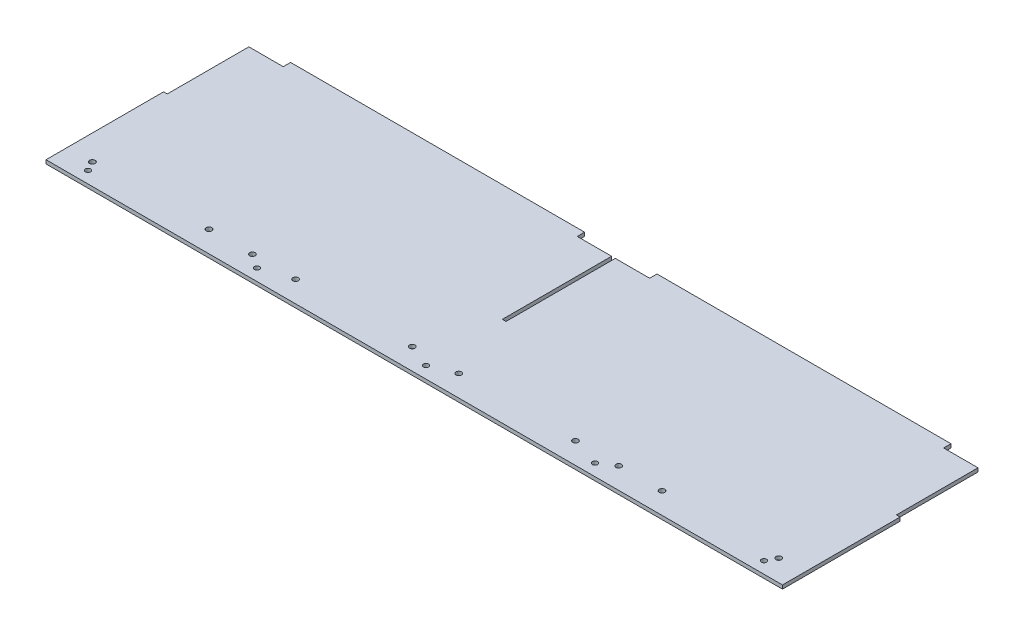
ISO-10303-21;
HEADER;
FILE_DESCRIPTION(('STEP AP214'),'2;1');
FILE_NAME('part.step','',(''),(''),'','','');
FILE_SCHEMA(('AUTOMOTIVE_DESIGN { 1 0 10303 214 1 1 1 1 }'));
ENDSEC;
DATA;
#1=APPLICATION_CONTEXT('core data for automotive mechanical design processes');
#2=APPLICATION_PROTOCOL_DEFINITION('international standard','automotive_design',2000,#1);
#3=PRODUCT_CONTEXT('',#1,'mechanical');
#4=PRODUCT('Part','Part','',(#3));
#5=PRODUCT_RELATED_PRODUCT_CATEGORY('part','',(#4));
#6=PRODUCT_DEFINITION_FORMATION('','',#4);
#7=PRODUCT_DEFINITION_CONTEXT('part definition',#1,'design');
#8=PRODUCT_DEFINITION('design','',#6,#7);
#9=PRODUCT_DEFINITION_SHAPE('','',#8);
#10=(LENGTH_UNIT() NAMED_UNIT(*) SI_UNIT(.MILLI.,.METRE.));
#11=(NAMED_UNIT(*) PLANE_ANGLE_UNIT() SI_UNIT($,.RADIAN.));
#12=(NAMED_UNIT(*) SI_UNIT($,.STERADIAN.) SOLID_ANGLE_UNIT());
#13=UNCERTAINTY_MEASURE_WITH_UNIT(LENGTH_MEASURE(1.E-05),#10,'distance_accuracy_value','');
#14=(GEOMETRIC_REPRESENTATION_CONTEXT(3) GLOBAL_UNCERTAINTY_ASSIGNED_CONTEXT((#13)) GLOBAL_UNIT_ASSIGNED_CONTEXT((#10,
#11,#12)) REPRESENTATION_CONTEXT('',''));
#15=CARTESIAN_POINT('',(0.,0.,0.));
#16=DIRECTION('',(0.,0.,1.));
#17=DIRECTION('',(1.,0.,0.));
#18=AXIS2_PLACEMENT_3D('',#15,#16,#17);
#19=CARTESIAN_POINT('',(0.,3.175,0.));
#20=DIRECTION('',(0.,-1.,0.));
#21=DIRECTION('',(0.,0.,-1.));
#22=AXIS2_PLACEMENT_3D('',#19,#20,#21);
#23=PLANE('',#22);
#24=CARTESIAN_POINT('',(21.6825334955514,3.175,-18.3973199489995));
#25=DIRECTION('',(0.,1.,0.));
#26=DIRECTION('',(0.,0.,1.));
#27=AXIS2_PLACEMENT_3D('',#24,#25,#26);
#28=CIRCLE('',#27,2.39999999999999);
#29=CARTESIAN_POINT('',(21.6825334955514,3.175,-15.9973199489995));
#30=VERTEX_POINT('',#29);
#31=EDGE_CURVE('E714',#30,#30,#28,.T.);
#32=ORIENTED_EDGE('',*,*,#31,.F.);
#33=EDGE_LOOP('',(#32));
#34=FACE_BOUND('',#33,.T.);
#35=CARTESIAN_POINT('',(122.433944247832,3.175,-18.397319949));
#36=DIRECTION('',(0.,1.,0.));
#37=DIRECTION('',(0.,0.,1.));
#38=AXIS2_PLACEMENT_3D('',#35,#36,#37);
#39=CIRCLE('',#38,2.39999999999999);
#40=CARTESIAN_POINT('',(122.433944247832,3.175,-15.997319949));
#41=VERTEX_POINT('',#40);
#42=EDGE_CURVE('E716',#41,#41,#39,.T.);
#43=ORIENTED_EDGE('',*,*,#42,.F.);
#44=EDGE_LOOP('',(#43));
#45=FACE_BOUND('',#44,.T.);
#46=CARTESIAN_POINT('',(159.858710000075,3.175,-18.3973199490005));
#47=DIRECTION('',(0.,1.,0.));
#48=DIRECTION('',(0.,0.,1.));
#49=AXIS2_PLACEMENT_3D('',#46,#47,#48);
#50=CIRCLE('',#49,2.39999999999999);
#51=CARTESIAN_POINT('',(159.858710000075,3.175,-15.9973199490005));
#52=VERTEX_POINT('',#51);
#53=EDGE_CURVE('E724',#52,#52,#50,.T.);
#54=ORIENTED_EDGE('',*,*,#53,.F.);
#55=EDGE_LOOP('',(#54));
#56=FACE_BOUND('',#55,.T.);
#57=CARTESIAN_POINT('',(197.283475752318,3.175,-18.3973199490008));
#58=DIRECTION('',(0.,1.,0.));
#59=DIRECTION('',(0.,0.,1.));
#60=AXIS2_PLACEMENT_3D('',#57,#58,#59);
#61=CIRCLE('',#60,2.39999999999999);
#62=CARTESIAN_POINT('',(197.283475752318,3.175,-15.9973199490008));
#63=VERTEX_POINT('',#62);
#64=EDGE_CURVE('E730',#63,#63,#61,.T.);
#65=ORIENTED_EDGE('',*,*,#64,.F.);
#66=EDGE_LOOP('',(#65));
#67=FACE_BOUND('',#66,.T.);
#68=CARTESIAN_POINT('',(298.034886504599,3.175,-18.3973199490015));
#69=DIRECTION('',(0.,1.,0.));
#70=DIRECTION('',(0.,0.,1.));
#71=AXIS2_PLACEMENT_3D('',#68,#69,#70);
#72=CIRCLE('',#71,2.40000000000001);
#73=CARTESIAN_POINT('',(298.034886504599,3.175,-15.9973199490014));
#74=VERTEX_POINT('',#73);
#75=EDGE_CURVE('E736',#74,#74,#72,.T.);
#76=ORIENTED_EDGE('',*,*,#75,.F.);
#77=EDGE_LOOP('',(#76));
#78=FACE_BOUND('',#77,.T.);
#79=CARTESIAN_POINT('',(338.224953495399,3.175,-18.3973199490015));
#80=DIRECTION('',(0.,1.,0.));
#81=DIRECTION('',(0.,0.,1.));
#82=AXIS2_PLACEMENT_3D('',#79,#80,#81);
#83=CIRCLE('',#82,2.40000000000001);
#84=CARTESIAN_POINT('',(338.224953495399,3.175,-15.9973199490014));
#85=VERTEX_POINT('',#84);
#86=EDGE_CURVE('E742',#85,#85,#83,.T.);
#87=ORIENTED_EDGE('',*,*,#86,.F.);
#88=EDGE_LOOP('',(#87));
#89=FACE_BOUND('',#88,.T.);
#90=CARTESIAN_POINT('',(438.97636424768,3.175,-18.3973199490008));
#91=DIRECTION('',(0.,1.,0.));
#92=DIRECTION('',(0.,0.,1.));
#93=AXIS2_PLACEMENT_3D('',#90,#91,#92);
#94=CIRCLE('',#93,2.40000000000001);
#95=CARTESIAN_POINT('',(438.97636424768,3.175,-15.9973199490008));
#96=VERTEX_POINT('',#95);
#97=EDGE_CURVE('E748',#96,#96,#94,.T.);
#98=ORIENTED_EDGE('',*,*,#97,.F.);
#99=EDGE_LOOP('',(#98));
#100=FACE_BOUND('',#99,.T.);
#101=CARTESIAN_POINT('',(513.825895752166,3.175,-18.397319949));
#102=DIRECTION('',(0.,1.,0.));
#103=DIRECTION('',(0.,0.,1.));
#104=AXIS2_PLACEMENT_3D('',#101,#102,#103);
#105=CIRCLE('',#104,2.39999999999996);
#106=CARTESIAN_POINT('',(513.825895752166,3.175,-15.9973199490001));
#107=VERTEX_POINT('',#106);
#108=EDGE_CURVE('E760',#107,#107,#105,.T.);
#109=ORIENTED_EDGE('',*,*,#108,.F.);
#110=EDGE_LOOP('',(#109));
#111=FACE_BOUND('',#110,.T.);
#112=CARTESIAN_POINT('',(614.577306504446,3.175,-18.3973199489995));
#113=DIRECTION('',(0.,1.,0.));
#114=DIRECTION('',(0.,0.,1.));
#115=AXIS2_PLACEMENT_3D('',#112,#113,#114);
#116=CIRCLE('',#115,2.39999999999996);
#117=CARTESIAN_POINT('',(614.577306504446,3.175,-15.9973199489996));
#118=VERTEX_POINT('',#117);
#119=EDGE_CURVE('E766',#118,#118,#116,.T.);
#120=ORIENTED_EDGE('',*,*,#119,.F.);
#121=EDGE_LOOP('',(#120));
#122=FACE_BOUND('',#121,.T.);
#123=CARTESIAN_POINT('',(26.1071067810834,3.175,-10.1600000000008));
#124=DIRECTION('',(0.,1.,0.));
#125=DIRECTION('',(0.,0.,1.));
#126=AXIS2_PLACEMENT_3D('',#123,#124,#125);
#127=CIRCLE('',#126,2.25);
#128=CARTESIAN_POINT('',(26.1071067810834,3.175,-7.91000000000078));
#129=VERTEX_POINT('',#128);
#130=EDGE_CURVE('E776',#129,#129,#127,.T.);
#131=ORIENTED_EDGE('',*,*,#130,.F.);
#132=EDGE_LOOP('',(#131));
#133=FACE_BOUND('',#132,.T.);
#134=CARTESIAN_POINT('',(172.118513390515,3.175,-10.1600000000008));
#135=DIRECTION('',(0.,1.,0.));
#136=DIRECTION('',(0.,0.,1.));
#137=AXIS2_PLACEMENT_3D('',#134,#135,#136);
#138=CIRCLE('',#137,2.25000000000001);
#139=CARTESIAN_POINT('',(172.118513390515,3.175,-7.91000000000077));
#140=VERTEX_POINT('',#139);
#141=EDGE_CURVE('E782',#140,#140,#138,.T.);
#142=ORIENTED_EDGE('',*,*,#141,.F.);
#143=EDGE_LOOP('',(#142));
#144=FACE_BOUND('',#143,.T.);
#145=CARTESIAN_POINT('',(318.129919999947,3.175,-10.1600000000008));
#146=DIRECTION('',(0.,1.,0.));
#147=DIRECTION('',(0.,0.,1.));
#148=AXIS2_PLACEMENT_3D('',#145,#146,#147);
#149=CIRCLE('',#148,2.24999999999995);
#150=CARTESIAN_POINT('',(318.129919999947,3.175,-7.91000000000083));
#151=VERTEX_POINT('',#150);
#152=EDGE_CURVE('E788',#151,#151,#149,.T.);
#153=ORIENTED_EDGE('',*,*,#152,.F.);
#154=EDGE_LOOP('',(#153));
#155=FACE_BOUND('',#154,.T.);
#156=CARTESIAN_POINT('',(464.141326609379,3.175,-10.1600000000008));
#157=DIRECTION('',(0.,1.,0.));
#158=DIRECTION('',(0.,0.,1.));
#159=AXIS2_PLACEMENT_3D('',#156,#157,#158);
#160=CIRCLE('',#159,2.24999999999995);
#161=CARTESIAN_POINT('',(464.141326609379,3.175,-7.91000000000088));
#162=VERTEX_POINT('',#161);
#163=EDGE_CURVE('E794',#162,#162,#160,.T.);
#164=ORIENTED_EDGE('',*,*,#163,.F.);
#165=EDGE_LOOP('',(#164));
#166=FACE_BOUND('',#165,.T.);
#167=CARTESIAN_POINT('',(610.152733218811,3.175,-10.1600000000008));
#168=DIRECTION('',(0.,1.,0.));
#169=DIRECTION('',(0.,0.,1.));
#170=AXIS2_PLACEMENT_3D('',#167,#168,#169);
#171=CIRCLE('',#170,2.25000000000001);
#172=CARTESIAN_POINT('',(610.152733218811,3.175,-7.91000000000083));
#173=VERTEX_POINT('',#172);
#174=EDGE_CURVE('E772',#173,#173,#171,.T.);
#175=ORIENTED_EDGE('',*,*,#174,.F.);
#176=EDGE_LOOP('',(#175));
#177=FACE_BOUND('',#176,.T.);
#178=DIRECTION('',(0.,0.,-1.));
#179=VECTOR('',#178,1.);
#180=CARTESIAN_POINT('',(0.,3.175,0.));
#181=LINE('',#180,#179);
#182=CARTESIAN_POINT('',(0.,3.175,0.));
#183=VERTEX_POINT('',#182);
#184=CARTESIAN_POINT('',(0.,3.175,-101.6));
#185=VERTEX_POINT('',#184);
#186=EDGE_CURVE('E308',#183,#185,#181,.T.);
#187=ORIENTED_EDGE('',*,*,#186,.F.);
#188=DIRECTION('',(1.,0.,0.));
#189=VECTOR('',#188,1.);
#190=CARTESIAN_POINT('',(0.,3.175,0.));
#191=LINE('',#190,#189);
#192=CARTESIAN_POINT('',(636.25984,3.175,0.));
#193=VERTEX_POINT('',#192);
#194=EDGE_CURVE('E229',#183,#193,#191,.T.);
#195=ORIENTED_EDGE('',*,*,#194,.T.);
#196=DIRECTION('',(0.,0.,-1.));
#197=VECTOR('',#196,1.);
#198=CARTESIAN_POINT('',(636.25984,3.175,0.));
#199=LINE('',#198,#197);
#200=CARTESIAN_POINT('',(636.25984,3.175,-101.6));
#201=VERTEX_POINT('',#200);
#202=EDGE_CURVE('E11',#193,#201,#199,.T.);
#203=ORIENTED_EDGE('',*,*,#202,.T.);
#204=DIRECTION('',(-1.,0.,0.));
#205=VECTOR('',#204,1.);
#206=CARTESIAN_POINT('',(636.25984,3.175,-101.6));
#207=LINE('',#206,#205);
#208=CARTESIAN_POINT('',(633.08484,3.175,-101.6));
#209=VERTEX_POINT('',#208);
#210=EDGE_CURVE('E266',#201,#209,#207,.T.);
#211=ORIENTED_EDGE('',*,*,#210,.T.);
#212=DIRECTION('',(0.,0.,-1.));
#213=VECTOR('',#212,1.);
#214=CARTESIAN_POINT('',(633.08484,3.175,-101.6));
#215=LINE('',#214,#213);
#216=CARTESIAN_POINT('',(633.08484,3.175,-172.09262));
#217=VERTEX_POINT('',#216);
#218=EDGE_CURVE('E257',#209,#217,#215,.T.);
#219=ORIENTED_EDGE('',*,*,#218,.T.);
#220=DIRECTION('',(1.,0.,0.));
#221=VECTOR('',#220,1.);
#222=CARTESIAN_POINT('',(0.,3.175,-172.09262));
#223=LINE('',#222,#221);
#224=CARTESIAN_POINT('',(603.40113,3.17500000000132,-172.09262));
#225=VERTEX_POINT('',#224);
#226=EDGE_CURVE('E310',#225,#217,#223,.T.);
#227=ORIENTED_EDGE('',*,*,#226,.F.);
#228=DIRECTION('',(0.,0.,1.));
#229=VECTOR('',#228,1.);
#230=CARTESIAN_POINT('',(603.40113,3.17500000000132,-178.44262));
#231=LINE('',#230,#229);
#232=CARTESIAN_POINT('',(603.40113,3.17500000000132,-178.44262));
#233=VERTEX_POINT('',#232);
#234=EDGE_CURVE('E218',#233,#225,#231,.T.);
#235=ORIENTED_EDGE('',*,*,#234,.F.);
#236=DIRECTION('',(1.,0.,0.));
#237=VECTOR('',#236,1.);
#238=CARTESIAN_POINT('',(603.40113,3.17500000000132,-178.44262));
#239=LINE('',#238,#237);
#240=CARTESIAN_POINT('',(349.40113,3.17500000000132,-178.44262));
#241=VERTEX_POINT('',#240);
#242=EDGE_CURVE('E217',#241,#233,#239,.T.);
#243=ORIENTED_EDGE('',*,*,#242,.F.);
#244=DIRECTION('',(0.,0.,1.));
#245=VECTOR('',#244,1.);
#246=CARTESIAN_POINT('',(349.40113,3.17500000000132,-178.44262));
#247=LINE('',#246,#245);
#248=CARTESIAN_POINT('',(349.40113,3.17500000000132,-172.09262));
#249=VERTEX_POINT('',#248);
#250=EDGE_CURVE('E222',#241,#249,#247,.T.);
#251=ORIENTED_EDGE('',*,*,#250,.T.);
#252=CARTESIAN_POINT('',(319.717419999999,3.17500000000132,-172.09262));
#253=VERTEX_POINT('',#252);
#254=EDGE_CURVE('E312',#253,#249,#223,.T.);
#255=ORIENTED_EDGE('',*,*,#254,.F.);
#256=DIRECTION('',(0.,0.,-1.));
#257=VECTOR('',#256,1.);
#258=CARTESIAN_POINT('',(319.717419999999,3.17500000000132,-77.72654));
#259=LINE('',#258,#257);
#260=CARTESIAN_POINT('',(319.717419999999,3.17500000000132,-77.72654));
#261=VERTEX_POINT('',#260);
#262=EDGE_CURVE('E297',#261,#253,#259,.T.);
#263=ORIENTED_EDGE('',*,*,#262,.F.);
#264=DIRECTION('',(1.,-3.32192716029536E-13,0.));
#265=VECTOR('',#264,1.);
#266=CARTESIAN_POINT('',(319.717419999999,3.17500000000132,-77.72654));
#267=LINE('',#266,#265);
#268=CARTESIAN_POINT('',(316.542419999999,3.17500000000237,-77.72654));
#269=VERTEX_POINT('',#268);
#270=EDGE_CURVE('E290',#269,#261,#267,.T.);
#271=ORIENTED_EDGE('',*,*,#270,.F.);
#272=DIRECTION('',(0.,0.,-1.));
#273=VECTOR('',#272,1.);
#274=CARTESIAN_POINT('',(316.542419999999,3.17500000000237,-77.72654));
#275=LINE('',#274,#273);
#276=CARTESIAN_POINT('',(316.542419999999,3.17500000000237,-172.09262));
#277=VERTEX_POINT('',#276);
#278=EDGE_CURVE('E300',#269,#277,#275,.T.);
#279=ORIENTED_EDGE('',*,*,#278,.T.);
#280=CARTESIAN_POINT('',(286.858709999998,3.17500000000132,-172.09262));
#281=VERTEX_POINT('',#280);
#282=EDGE_CURVE('E311',#281,#277,#223,.T.);
#283=ORIENTED_EDGE('',*,*,#282,.F.);
#284=DIRECTION('',(0.,0.,1.));
#285=VECTOR('',#284,1.);
#286=CARTESIAN_POINT('',(286.858709999998,3.17500000000132,-178.44262));
#287=LINE('',#286,#285);
#288=CARTESIAN_POINT('',(286.858709999998,3.17500000000132,-178.44262));
#289=VERTEX_POINT('',#288);
#290=EDGE_CURVE('E187',#289,#281,#287,.T.);
#291=ORIENTED_EDGE('',*,*,#290,.F.);
#292=DIRECTION('',(1.,0.,0.));
#293=VECTOR('',#292,1.);
#294=CARTESIAN_POINT('',(32.858709999998,3.17500000000132,-178.44262));
#295=LINE('',#294,#293);
#296=CARTESIAN_POINT('',(32.858709999998,3.17500000000132,-178.44262));
#297=VERTEX_POINT('',#296);
#298=EDGE_CURVE('E179',#297,#289,#295,.T.);
#299=ORIENTED_EDGE('',*,*,#298,.F.);
#300=DIRECTION('',(0.,0.,1.));
#301=VECTOR('',#300,1.);
#302=CARTESIAN_POINT('',(32.858709999998,3.17500000000132,-178.44262));
#303=LINE('',#302,#301);
#304=CARTESIAN_POINT('',(32.858709999998,3.17500000000132,-172.09262));
#305=VERTEX_POINT('',#304);
#306=EDGE_CURVE('E184',#297,#305,#303,.T.);
#307=ORIENTED_EDGE('',*,*,#306,.T.);
#308=CARTESIAN_POINT('',(3.175,3.175,-172.09262));
#309=VERTEX_POINT('',#308);
#310=EDGE_CURVE('E49',#309,#305,#223,.T.);
#311=ORIENTED_EDGE('',*,*,#310,.F.);
#312=DIRECTION('',(0.,0.,-1.));
#313=VECTOR('',#312,1.);
#314=CARTESIAN_POINT('',(3.175,3.175,-101.6));
#315=LINE('',#314,#313);
#316=CARTESIAN_POINT('',(3.175,3.175,-101.6));
#317=VERTEX_POINT('',#316);
#318=EDGE_CURVE('E254',#317,#309,#315,.T.);
#319=ORIENTED_EDGE('',*,*,#318,.F.);
#320=DIRECTION('',(-1.,0.,0.));
#321=VECTOR('',#320,1.);
#322=CARTESIAN_POINT('',(0.,3.175,-101.6));
#323=LINE('',#322,#321);
#324=EDGE_CURVE('E251',#317,#185,#323,.T.);
#325=ORIENTED_EDGE('',*,*,#324,.T.);
#326=EDGE_LOOP('',(#187,#195,#203,#211,#219,#227,#235,#243,#251,#255,#263,#271,#279,#283,#291,
#299,#307,#311,#319,#325));
#327=FACE_BOUND('',#326,.T.);
#328=CARTESIAN_POINT('',(476.401129999923,3.175,-18.3973199490005));
#329=DIRECTION('',(0.,1.,0.));
#330=DIRECTION('',(0.,0.,1.));
#331=AXIS2_PLACEMENT_3D('',#328,#329,#330);
#332=CIRCLE('',#331,2.40000000000001);
#333=CARTESIAN_POINT('',(476.401129999923,3.175,-15.9973199490005));
#334=VERTEX_POINT('',#333);
#335=EDGE_CURVE('E754',#334,#334,#332,.T.);
#336=ORIENTED_EDGE('',*,*,#335,.F.);
#337=EDGE_LOOP('',(#336));
#338=FACE_BOUND('',#337,.T.);
#339=ADVANCED_FACE('F40',(#34,#45,#56,#67,#78,#89,#100,#111,#122,#133,#144,#155,#166,#177,#327,
#338),#23,.F.);
#340=CARTESIAN_POINT('',(0.,3.175,-172.09262));
#341=DIRECTION('',(0.,0.,-1.));
#342=DIRECTION('',(-1.,0.,0.));
#343=AXIS2_PLACEMENT_3D('',#340,#341,#342);
#344=PLANE('',#343);
#345=ORIENTED_EDGE('',*,*,#310,.T.);
#346=DIRECTION('',(0.,1.,0.));
#347=VECTOR('',#346,1.);
#348=CARTESIAN_POINT('',(32.858709999998,3.17500000000132,-172.09262));
#349=LINE('',#348,#347);
#350=CARTESIAN_POINT('',(32.858709999998,9.43689570931383E-13,-172.09262));
#351=VERTEX_POINT('',#350);
#352=EDGE_CURVE('E202',#351,#305,#349,.T.);
#353=ORIENTED_EDGE('',*,*,#352,.F.);
#354=DIRECTION('',(1.,0.,0.));
#355=VECTOR('',#354,1.);
#356=CARTESIAN_POINT('',(0.,0.,-172.09262));
#357=LINE('',#356,#355);
#358=CARTESIAN_POINT('',(3.175,0.,-172.09262));
#359=VERTEX_POINT('',#358);
#360=EDGE_CURVE('E315',#359,#351,#357,.T.);
#361=ORIENTED_EDGE('',*,*,#360,.F.);
#362=DIRECTION('',(0.,1.,0.));
#363=VECTOR('',#362,1.);
#364=CARTESIAN_POINT('',(3.175,3.175,-172.09262));
#365=LINE('',#364,#363);
#366=EDGE_CURVE('E246',#359,#309,#365,.T.);
#367=ORIENTED_EDGE('',*,*,#366,.T.);
#368=EDGE_LOOP('',(#345,#353,#361,#367));
#369=FACE_BOUND('',#368,.T.);
#370=ADVANCED_FACE('F378',(#369),#344,.T.);
#371=CARTESIAN_POINT('',(286.858709999998,0.,-172.09262));
#372=VERTEX_POINT('',#371);
#373=CARTESIAN_POINT('',(316.542419999999,9.43689570931383E-13,-172.09262));
#374=VERTEX_POINT('',#373);
#375=EDGE_CURVE('E317',#372,#374,#357,.T.);
#376=ORIENTED_EDGE('',*,*,#375,.F.);
#377=DIRECTION('',(0.,-1.,0.));
#378=VECTOR('',#377,1.);
#379=CARTESIAN_POINT('',(286.858709999998,3.17500000000132,-172.09262));
#380=LINE('',#379,#378);
#381=EDGE_CURVE('E198',#281,#372,#380,.T.);
#382=ORIENTED_EDGE('',*,*,#381,.F.);
#383=ORIENTED_EDGE('',*,*,#282,.T.);
#384=DIRECTION('',(0.,1.,0.));
#385=VECTOR('',#384,1.);
#386=CARTESIAN_POINT('',(316.542419999999,3.17500000000237,-172.09262));
#387=LINE('',#386,#385);
#388=EDGE_CURVE('E284',#374,#277,#387,.T.);
#389=ORIENTED_EDGE('',*,*,#388,.F.);
#390=EDGE_LOOP('',(#376,#382,#383,#389));
#391=FACE_BOUND('',#390,.T.);
#392=ADVANCED_FACE('F340',(#391),#344,.T.);
#393=CARTESIAN_POINT('',(603.40113,0.,-172.09262));
#394=VERTEX_POINT('',#393);
#395=CARTESIAN_POINT('',(633.08484,0.,-172.09262));
#396=VERTEX_POINT('',#395);
#397=EDGE_CURVE('E314',#394,#396,#357,.T.);
#398=ORIENTED_EDGE('',*,*,#397,.F.);
#399=DIRECTION('',(0.,-1.,0.));
#400=VECTOR('',#399,1.);
#401=CARTESIAN_POINT('',(603.40113,3.17500000000132,-172.09262));
#402=LINE('',#401,#400);
#403=EDGE_CURVE('E65',#225,#394,#402,.T.);
#404=ORIENTED_EDGE('',*,*,#403,.F.);
#405=ORIENTED_EDGE('',*,*,#226,.T.);
#406=DIRECTION('',(0.,-1.,0.));
#407=VECTOR('',#406,1.);
#408=CARTESIAN_POINT('',(633.08484,3.175,-172.09262));
#409=LINE('',#408,#407);
#410=EDGE_CURVE('E239',#217,#396,#409,.T.);
#411=ORIENTED_EDGE('',*,*,#410,.T.);
#412=EDGE_LOOP('',(#398,#404,#405,#411));
#413=FACE_BOUND('',#412,.T.);
#414=ADVANCED_FACE('F332',(#413),#344,.T.);
#415=ORIENTED_EDGE('',*,*,#254,.T.);
#416=DIRECTION('',(0.,1.,0.));
#417=VECTOR('',#416,1.);
#418=CARTESIAN_POINT('',(349.40113,3.17500000000132,-172.09262));
#419=LINE('',#418,#417);
#420=CARTESIAN_POINT('',(349.40113,9.43689570931383E-13,-172.09262));
#421=VERTEX_POINT('',#420);
#422=EDGE_CURVE('E205',#421,#249,#419,.T.);
#423=ORIENTED_EDGE('',*,*,#422,.F.);
#424=CARTESIAN_POINT('',(319.717419999999,9.43689570931383E-13,-172.09262));
#425=VERTEX_POINT('',#424);
#426=EDGE_CURVE('E318',#425,#421,#357,.T.);
#427=ORIENTED_EDGE('',*,*,#426,.F.);
#428=DIRECTION('',(0.,-1.,0.));
#429=VECTOR('',#428,1.);
#430=CARTESIAN_POINT('',(319.717419999999,3.17500000000132,-172.09262));
#431=LINE('',#430,#429);
#432=EDGE_CURVE('E262',#253,#425,#431,.T.);
#433=ORIENTED_EDGE('',*,*,#432,.F.);
#434=EDGE_LOOP('',(#415,#423,#427,#433));
#435=FACE_BOUND('',#434,.T.);
#436=ADVANCED_FACE('F355',(#435),#344,.T.);
#437=CARTESIAN_POINT('',(636.25984,3.175,0.));
#438=DIRECTION('',(-1.,0.,0.));
#439=DIRECTION('',(0.,0.,1.));
#440=AXIS2_PLACEMENT_3D('',#437,#438,#439);
#441=PLANE('',#440);
#442=ORIENTED_EDGE('',*,*,#202,.F.);
#443=DIRECTION('',(0.,1.,0.));
#444=VECTOR('',#443,1.);
#445=CARTESIAN_POINT('',(636.25984,0.,0.));
#446=LINE('',#445,#444);
#447=CARTESIAN_POINT('',(636.25984,0.,0.));
#448=VERTEX_POINT('',#447);
#449=EDGE_CURVE('E236',#448,#193,#446,.T.);
#450=ORIENTED_EDGE('',*,*,#449,.F.);
#451=DIRECTION('',(0.,0.,-1.));
#452=VECTOR('',#451,1.);
#453=CARTESIAN_POINT('',(636.25984,0.,0.));
#454=LINE('',#453,#452);
#455=CARTESIAN_POINT('',(636.25984,0.,-101.6));
#456=VERTEX_POINT('',#455);
#457=EDGE_CURVE('E44',#448,#456,#454,.T.);
#458=ORIENTED_EDGE('',*,*,#457,.T.);
#459=DIRECTION('',(0.,1.,0.));
#460=VECTOR('',#459,1.);
#461=CARTESIAN_POINT('',(636.25984,3.175,-101.6));
#462=LINE('',#461,#460);
#463=EDGE_CURVE('E263',#456,#201,#462,.T.);
#464=ORIENTED_EDGE('',*,*,#463,.T.);
#465=EDGE_LOOP('',(#442,#450,#458,#464));
#466=FACE_BOUND('',#465,.T.);
#467=ADVANCED_FACE('F394',(#466),#441,.F.);
#468=CARTESIAN_POINT('',(0.,0.,0.));
#469=DIRECTION('',(0.,-1.,0.));
#470=DIRECTION('',(0.,0.,-1.));
#471=AXIS2_PLACEMENT_3D('',#468,#469,#470);
#472=PLANE('',#471);
#473=CARTESIAN_POINT('',(21.6825334955514,0.,-18.3973199489995));
#474=DIRECTION('',(0.,1.,0.));
#475=DIRECTION('',(0.,0.,1.));
#476=AXIS2_PLACEMENT_3D('',#473,#474,#475);
#477=CIRCLE('',#476,2.4);
#478=CARTESIAN_POINT('',(21.6825334955514,0.,-15.9973199489995));
#479=VERTEX_POINT('',#478);
#480=EDGE_CURVE('E712',#479,#479,#477,.T.);
#481=ORIENTED_EDGE('',*,*,#480,.T.);
#482=EDGE_LOOP('',(#481));
#483=FACE_BOUND('',#482,.T.);
#484=CARTESIAN_POINT('',(122.433944247832,0.,-18.397319949));
#485=DIRECTION('',(0.,1.,0.));
#486=DIRECTION('',(0.,0.,1.));
#487=AXIS2_PLACEMENT_3D('',#484,#485,#486);
#488=CIRCLE('',#487,2.4);
#489=CARTESIAN_POINT('',(122.433944247832,0.,-15.997319949));
#490=VERTEX_POINT('',#489);
#491=EDGE_CURVE('E721',#490,#490,#488,.T.);
#492=ORIENTED_EDGE('',*,*,#491,.T.);
#493=EDGE_LOOP('',(#492));
#494=FACE_BOUND('',#493,.T.);
#495=CARTESIAN_POINT('',(159.858710000075,0.,-18.3973199490005));
#496=DIRECTION('',(0.,1.,0.));
#497=DIRECTION('',(0.,0.,1.));
#498=AXIS2_PLACEMENT_3D('',#495,#496,#497);
#499=CIRCLE('',#498,2.39999999999999);
#500=CARTESIAN_POINT('',(159.858710000075,0.,-15.9973199490005));
#501=VERTEX_POINT('',#500);
#502=EDGE_CURVE('E727',#501,#501,#499,.T.);
#503=ORIENTED_EDGE('',*,*,#502,.T.);
#504=EDGE_LOOP('',(#503));
#505=FACE_BOUND('',#504,.T.);
#506=CARTESIAN_POINT('',(197.283475752318,0.,-18.3973199490008));
#507=DIRECTION('',(0.,1.,0.));
#508=DIRECTION('',(0.,0.,1.));
#509=AXIS2_PLACEMENT_3D('',#506,#507,#508);
#510=CIRCLE('',#509,2.39999999999999);
#511=CARTESIAN_POINT('',(197.283475752318,0.,-15.9973199490008));
#512=VERTEX_POINT('',#511);
#513=EDGE_CURVE('E733',#512,#512,#510,.T.);
#514=ORIENTED_EDGE('',*,*,#513,.T.);
#515=EDGE_LOOP('',(#514));
#516=FACE_BOUND('',#515,.T.);
#517=CARTESIAN_POINT('',(298.034886504599,0.,-18.3973199490015));
#518=DIRECTION('',(0.,1.,0.));
#519=DIRECTION('',(0.,0.,1.));
#520=AXIS2_PLACEMENT_3D('',#517,#518,#519);
#521=CIRCLE('',#520,2.40000000000001);
#522=CARTESIAN_POINT('',(298.034886504599,0.,-15.9973199490014));
#523=VERTEX_POINT('',#522);
#524=EDGE_CURVE('E739',#523,#523,#521,.T.);
#525=ORIENTED_EDGE('',*,*,#524,.T.);
#526=EDGE_LOOP('',(#525));
#527=FACE_BOUND('',#526,.T.);
#528=CARTESIAN_POINT('',(338.224953495399,0.,-18.3973199490015));
#529=DIRECTION('',(0.,1.,0.));
#530=DIRECTION('',(0.,0.,1.));
#531=AXIS2_PLACEMENT_3D('',#528,#529,#530);
#532=CIRCLE('',#531,2.40000000000001);
#533=CARTESIAN_POINT('',(338.224953495399,0.,-15.9973199490014));
#534=VERTEX_POINT('',#533);
#535=EDGE_CURVE('E745',#534,#534,#532,.T.);
#536=ORIENTED_EDGE('',*,*,#535,.T.);
#537=EDGE_LOOP('',(#536));
#538=FACE_BOUND('',#537,.T.);
#539=CARTESIAN_POINT('',(438.97636424768,0.,-18.3973199490008));
#540=DIRECTION('',(0.,1.,0.));
#541=DIRECTION('',(0.,0.,1.));
#542=AXIS2_PLACEMENT_3D('',#539,#540,#541);
#543=CIRCLE('',#542,2.40000000000001);
#544=CARTESIAN_POINT('',(438.97636424768,0.,-15.9973199490008));
#545=VERTEX_POINT('',#544);
#546=EDGE_CURVE('E751',#545,#545,#543,.T.);
#547=ORIENTED_EDGE('',*,*,#546,.T.);
#548=EDGE_LOOP('',(#547));
#549=FACE_BOUND('',#548,.T.);
#550=CARTESIAN_POINT('',(476.401129999923,0.,-18.3973199490005));
#551=DIRECTION('',(0.,1.,0.));
#552=DIRECTION('',(0.,0.,1.));
#553=AXIS2_PLACEMENT_3D('',#550,#551,#552);
#554=CIRCLE('',#553,2.40000000000001);
#555=CARTESIAN_POINT('',(476.401129999923,0.,-15.9973199490005));
#556=VERTEX_POINT('',#555);
#557=EDGE_CURVE('E757',#556,#556,#554,.T.);
#558=ORIENTED_EDGE('',*,*,#557,.T.);
#559=EDGE_LOOP('',(#558));
#560=FACE_BOUND('',#559,.T.);
#561=CARTESIAN_POINT('',(513.825895752166,0.,-18.397319949));
#562=DIRECTION('',(0.,1.,0.));
#563=DIRECTION('',(0.,0.,1.));
#564=AXIS2_PLACEMENT_3D('',#561,#562,#563);
#565=CIRCLE('',#564,2.39999999999996);
#566=CARTESIAN_POINT('',(513.825895752166,0.,-15.9973199490001));
#567=VERTEX_POINT('',#566);
#568=EDGE_CURVE('E763',#567,#567,#565,.T.);
#569=ORIENTED_EDGE('',*,*,#568,.T.);
#570=EDGE_LOOP('',(#569));
#571=FACE_BOUND('',#570,.T.);
#572=CARTESIAN_POINT('',(614.577306504446,0.,-18.3973199489995));
#573=DIRECTION('',(0.,1.,0.));
#574=DIRECTION('',(0.,0.,1.));
#575=AXIS2_PLACEMENT_3D('',#572,#573,#574);
#576=CIRCLE('',#575,2.39999999999996);
#577=CARTESIAN_POINT('',(614.577306504446,0.,-15.9973199489996));
#578=VERTEX_POINT('',#577);
#579=EDGE_CURVE('E769',#578,#578,#576,.T.);
#580=ORIENTED_EDGE('',*,*,#579,.T.);
#581=EDGE_LOOP('',(#580));
#582=FACE_BOUND('',#581,.T.);
#583=CARTESIAN_POINT('',(26.1071067810834,0.,-10.1600000000008));
#584=DIRECTION('',(0.,1.,0.));
#585=DIRECTION('',(0.,0.,1.));
#586=AXIS2_PLACEMENT_3D('',#583,#584,#585);
#587=CIRCLE('',#586,2.25);
#588=CARTESIAN_POINT('',(26.1071067810834,0.,-7.91000000000078));
#589=VERTEX_POINT('',#588);
#590=EDGE_CURVE('E773',#589,#589,#587,.T.);
#591=ORIENTED_EDGE('',*,*,#590,.T.);
#592=EDGE_LOOP('',(#591));
#593=FACE_BOUND('',#592,.T.);
#594=CARTESIAN_POINT('',(172.118513390515,0.,-10.1600000000008));
#595=DIRECTION('',(0.,1.,0.));
#596=DIRECTION('',(0.,0.,1.));
#597=AXIS2_PLACEMENT_3D('',#594,#595,#596);
#598=CIRCLE('',#597,2.25000000000001);
#599=CARTESIAN_POINT('',(172.118513390515,0.,-7.91000000000077));
#600=VERTEX_POINT('',#599);
#601=EDGE_CURVE('E779',#600,#600,#598,.T.);
#602=ORIENTED_EDGE('',*,*,#601,.T.);
#603=EDGE_LOOP('',(#602));
#604=FACE_BOUND('',#603,.T.);
#605=CARTESIAN_POINT('',(318.129919999947,0.,-10.1600000000008));
#606=DIRECTION('',(0.,1.,0.));
#607=DIRECTION('',(0.,0.,1.));
#608=AXIS2_PLACEMENT_3D('',#605,#606,#607);
#609=CIRCLE('',#608,2.24999999999995);
#610=CARTESIAN_POINT('',(318.129919999947,0.,-7.91000000000083));
#611=VERTEX_POINT('',#610);
#612=EDGE_CURVE('E785',#611,#611,#609,.T.);
#613=ORIENTED_EDGE('',*,*,#612,.T.);
#614=EDGE_LOOP('',(#613));
#615=FACE_BOUND('',#614,.T.);
#616=CARTESIAN_POINT('',(464.141326609379,0.,-10.1600000000008));
#617=DIRECTION('',(0.,1.,0.));
#618=DIRECTION('',(0.,0.,1.));
#619=AXIS2_PLACEMENT_3D('',#616,#617,#618);
#620=CIRCLE('',#619,2.24999999999995);
#621=CARTESIAN_POINT('',(464.141326609379,0.,-7.91000000000088));
#622=VERTEX_POINT('',#621);
#623=EDGE_CURVE('E791',#622,#622,#620,.T.);
#624=ORIENTED_EDGE('',*,*,#623,.T.);
#625=EDGE_LOOP('',(#624));
#626=FACE_BOUND('',#625,.T.);
#627=CARTESIAN_POINT('',(610.152733218811,0.,-10.1600000000008));
#628=DIRECTION('',(0.,1.,0.));
#629=DIRECTION('',(0.,0.,1.));
#630=AXIS2_PLACEMENT_3D('',#627,#628,#629);
#631=CIRCLE('',#630,2.25000000000001);
#632=CARTESIAN_POINT('',(610.152733218811,0.,-7.91000000000083));
#633=VERTEX_POINT('',#632);
#634=EDGE_CURVE('E797',#633,#633,#631,.T.);
#635=ORIENTED_EDGE('',*,*,#634,.T.);
#636=EDGE_LOOP('',(#635));
#637=FACE_BOUND('',#636,.T.);
#638=ORIENTED_EDGE('',*,*,#457,.F.);
#639=DIRECTION('',(1.,0.,0.));
#640=VECTOR('',#639,1.);
#641=CARTESIAN_POINT('',(0.,0.,0.));
#642=LINE('',#641,#640);
#643=CARTESIAN_POINT('',(0.,0.,0.));
#644=VERTEX_POINT('',#643);
#645=EDGE_CURVE('E230',#644,#448,#642,.T.);
#646=ORIENTED_EDGE('',*,*,#645,.F.);
#647=DIRECTION('',(0.,0.,-1.));
#648=VECTOR('',#647,1.);
#649=CARTESIAN_POINT('',(0.,0.,0.));
#650=LINE('',#649,#648);
#651=CARTESIAN_POINT('',(0.,0.,-101.6));
#652=VERTEX_POINT('',#651);
#653=EDGE_CURVE('E299',#644,#652,#650,.T.);
#654=ORIENTED_EDGE('',*,*,#653,.T.);
#655=DIRECTION('',(1.,0.,0.));
#656=VECTOR('',#655,1.);
#657=CARTESIAN_POINT('',(0.,0.,-101.6));
#658=LINE('',#657,#656);
#659=CARTESIAN_POINT('',(3.175,0.,-101.6));
#660=VERTEX_POINT('',#659);
#661=EDGE_CURVE('E245',#652,#660,#658,.T.);
#662=ORIENTED_EDGE('',*,*,#661,.T.);
#663=DIRECTION('',(0.,0.,-1.));
#664=VECTOR('',#663,1.);
#665=CARTESIAN_POINT('',(3.175,0.,-101.6));
#666=LINE('',#665,#664);
#667=EDGE_CURVE('E259',#660,#359,#666,.T.);
#668=ORIENTED_EDGE('',*,*,#667,.T.);
#669=ORIENTED_EDGE('',*,*,#360,.T.);
#670=DIRECTION('',(0.,0.,1.));
#671=VECTOR('',#670,1.);
#672=CARTESIAN_POINT('',(32.858709999998,9.43689570931383E-13,-178.44262));
#673=LINE('',#672,#671);
#674=CARTESIAN_POINT('',(32.858709999998,9.43689570931383E-13,-178.44262));
#675=VERTEX_POINT('',#674);
#676=EDGE_CURVE('E804',#675,#351,#673,.T.);
#677=ORIENTED_EDGE('',*,*,#676,.F.);
#678=DIRECTION('',(-1.,0.,0.));
#679=VECTOR('',#678,1.);
#680=CARTESIAN_POINT('',(32.858709999998,9.43689570931383E-13,-178.44262));
#681=LINE('',#680,#679);
#682=CARTESIAN_POINT('',(286.858709999998,9.43689570931383E-13,-178.44262));
#683=VERTEX_POINT('',#682);
#684=EDGE_CURVE('E195',#683,#675,#681,.T.);
#685=ORIENTED_EDGE('',*,*,#684,.F.);
#686=DIRECTION('',(0.,0.,1.));
#687=VECTOR('',#686,1.);
#688=CARTESIAN_POINT('',(286.858709999998,9.43689570931383E-13,-178.44262));
#689=LINE('',#688,#687);
#690=EDGE_CURVE('E57',#683,#372,#689,.T.);
#691=ORIENTED_EDGE('',*,*,#690,.T.);
#692=ORIENTED_EDGE('',*,*,#375,.T.);
#693=DIRECTION('',(0.,0.,-1.));
#694=VECTOR('',#693,1.);
#695=CARTESIAN_POINT('',(316.542419999999,9.43689570931383E-13,-77.72654));
#696=LINE('',#695,#694);
#697=CARTESIAN_POINT('',(316.542419999999,9.43689570931383E-13,-77.72654));
#698=VERTEX_POINT('',#697);
#699=EDGE_CURVE('E303',#698,#374,#696,.T.);
#700=ORIENTED_EDGE('',*,*,#699,.F.);
#701=DIRECTION('',(-1.,0.,0.));
#702=VECTOR('',#701,1.);
#703=CARTESIAN_POINT('',(319.717419999999,9.43689570931383E-13,-77.72654));
#704=LINE('',#703,#702);
#705=CARTESIAN_POINT('',(319.717419999999,0.,-77.72654));
#706=VERTEX_POINT('',#705);
#707=EDGE_CURVE('E283',#706,#698,#704,.T.);
#708=ORIENTED_EDGE('',*,*,#707,.F.);
#709=DIRECTION('',(0.,0.,-1.));
#710=VECTOR('',#709,1.);
#711=CARTESIAN_POINT('',(319.717419999999,9.43689570931383E-13,-77.72654));
#712=LINE('',#711,#710);
#713=EDGE_CURVE('E293',#706,#425,#712,.T.);
#714=ORIENTED_EDGE('',*,*,#713,.T.);
#715=ORIENTED_EDGE('',*,*,#426,.T.);
#716=DIRECTION('',(0.,0.,1.));
#717=VECTOR('',#716,1.);
#718=CARTESIAN_POINT('',(349.40113,9.43689570931383E-13,-178.44262));
#719=LINE('',#718,#717);
#720=CARTESIAN_POINT('',(349.40113,9.43689570931383E-13,-178.44262));
#721=VERTEX_POINT('',#720);
#722=EDGE_CURVE('E225',#721,#421,#719,.T.);
#723=ORIENTED_EDGE('',*,*,#722,.F.);
#724=DIRECTION('',(-1.,0.,0.));
#725=VECTOR('',#724,1.);
#726=CARTESIAN_POINT('',(603.40113,9.43689570931383E-13,-178.44262));
#727=LINE('',#726,#725);
#728=CARTESIAN_POINT('',(603.40113,9.43689570931383E-13,-178.44262));
#729=VERTEX_POINT('',#728);
#730=EDGE_CURVE('E213',#729,#721,#727,.T.);
#731=ORIENTED_EDGE('',*,*,#730,.F.);
#732=DIRECTION('',(0.,0.,1.));
#733=VECTOR('',#732,1.);
#734=CARTESIAN_POINT('',(603.40113,9.43689570931383E-13,-178.44262));
#735=LINE('',#734,#733);
#736=EDGE_CURVE('E227',#729,#394,#735,.T.);
#737=ORIENTED_EDGE('',*,*,#736,.T.);
#738=ORIENTED_EDGE('',*,*,#397,.T.);
#739=DIRECTION('',(0.,0.,-1.));
#740=VECTOR('',#739,1.);
#741=CARTESIAN_POINT('',(633.08484,0.,-101.6));
#742=LINE('',#741,#740);
#743=CARTESIAN_POINT('',(633.08484,0.,-101.6));
#744=VERTEX_POINT('',#743);
#745=EDGE_CURVE('E274',#744,#396,#742,.T.);
#746=ORIENTED_EDGE('',*,*,#745,.F.);
#747=DIRECTION('',(1.,0.,0.));
#748=VECTOR('',#747,1.);
#749=CARTESIAN_POINT('',(636.25984,0.,-101.6));
#750=LINE('',#749,#748);
#751=EDGE_CURVE('E271',#744,#456,#750,.T.);
#752=ORIENTED_EDGE('',*,*,#751,.T.);
#753=EDGE_LOOP('',(#638,#646,#654,#662,#668,#669,#677,#685,#691,#692,#700,#708,#714,#715,#723,
#731,#737,#738,#746,#752));
#754=FACE_BOUND('',#753,.T.);
#755=ADVANCED_FACE('F325',(#483,#494,#505,#516,#527,#538,#549,#560,#571,#582,#593,#604,#615,
#626,#637,#754),#472,.T.);
#756=CARTESIAN_POINT('',(0.,3.175,0.));
#757=DIRECTION('',(-1.,0.,0.));
#758=DIRECTION('',(0.,0.,1.));
#759=AXIS2_PLACEMENT_3D('',#756,#757,#758);
#760=PLANE('',#759);
#761=ORIENTED_EDGE('',*,*,#653,.F.);
#762=DIRECTION('',(0.,1.,0.));
#763=VECTOR('',#762,1.);
#764=CARTESIAN_POINT('',(0.,0.,0.));
#765=LINE('',#764,#763);
#766=EDGE_CURVE('E233',#644,#183,#765,.T.);
#767=ORIENTED_EDGE('',*,*,#766,.T.);
#768=ORIENTED_EDGE('',*,*,#186,.T.);
#769=DIRECTION('',(0.,-1.,0.));
#770=VECTOR('',#769,1.);
#771=CARTESIAN_POINT('',(0.,3.175,-101.6));
#772=LINE('',#771,#770);
#773=EDGE_CURVE('E242',#185,#652,#772,.T.);
#774=ORIENTED_EDGE('',*,*,#773,.T.);
#775=EDGE_LOOP('',(#761,#767,#768,#774));
#776=FACE_BOUND('',#775,.T.);
#777=ADVANCED_FACE('F42',(#776),#760,.T.);
#778=CARTESIAN_POINT('',(319.717419999999,3.17500000000132,-77.72654));
#779=DIRECTION('',(1.,0.,0.));
#780=DIRECTION('',(0.,0.,-1.));
#781=AXIS2_PLACEMENT_3D('',#778,#779,#780);
#782=PLANE('',#781);
#783=ORIENTED_EDGE('',*,*,#432,.T.);
#784=ORIENTED_EDGE('',*,*,#713,.F.);
#785=DIRECTION('',(0.,-1.,0.));
#786=VECTOR('',#785,1.);
#787=CARTESIAN_POINT('',(319.717419999999,3.17500000000132,-77.72654));
#788=LINE('',#787,#786);
#789=EDGE_CURVE('E281',#261,#706,#788,.T.);
#790=ORIENTED_EDGE('',*,*,#789,.F.);
#791=ORIENTED_EDGE('',*,*,#262,.T.);
#792=EDGE_LOOP('',(#783,#784,#790,#791));
#793=FACE_BOUND('',#792,.T.);
#794=ADVANCED_FACE('F391',(#793),#782,.F.);
#795=CARTESIAN_POINT('',(316.542419999999,3.17500000000237,-77.72654));
#796=DIRECTION('',(-1.,0.,0.));
#797=DIRECTION('',(0.,0.,1.));
#798=AXIS2_PLACEMENT_3D('',#795,#796,#797);
#799=PLANE('',#798);
#800=ORIENTED_EDGE('',*,*,#388,.T.);
#801=ORIENTED_EDGE('',*,*,#278,.F.);
#802=DIRECTION('',(0.,1.,0.));
#803=VECTOR('',#802,1.);
#804=CARTESIAN_POINT('',(316.542419999999,3.17500000000237,-77.72654));
#805=LINE('',#804,#803);
#806=EDGE_CURVE('E287',#698,#269,#805,.T.);
#807=ORIENTED_EDGE('',*,*,#806,.F.);
#808=ORIENTED_EDGE('',*,*,#699,.T.);
#809=EDGE_LOOP('',(#800,#801,#807,#808));
#810=FACE_BOUND('',#809,.T.);
#811=ADVANCED_FACE('F342',(#810),#799,.F.);
#812=CARTESIAN_POINT('',(0.,0.,-77.72654));
#813=DIRECTION('',(0.,0.,-1.));
#814=DIRECTION('',(-1.,0.,0.));
#815=AXIS2_PLACEMENT_3D('',#812,#813,#814);
#816=PLANE('',#815);
#817=ORIENTED_EDGE('',*,*,#789,.T.);
#818=ORIENTED_EDGE('',*,*,#707,.T.);
#819=ORIENTED_EDGE('',*,*,#806,.T.);
#820=ORIENTED_EDGE('',*,*,#270,.T.);
#821=EDGE_LOOP('',(#817,#818,#819,#820));
#822=FACE_BOUND('',#821,.T.);
#823=ADVANCED_FACE('F348',(#822),#816,.T.);
#824=CARTESIAN_POINT('',(633.08484,3.175,-101.6));
#825=DIRECTION('',(1.,0.,0.));
#826=DIRECTION('',(0.,0.,-1.));
#827=AXIS2_PLACEMENT_3D('',#824,#825,#826);
#828=PLANE('',#827);
#829=ORIENTED_EDGE('',*,*,#410,.F.);
#830=ORIENTED_EDGE('',*,*,#218,.F.);
#831=DIRECTION('',(0.,-1.,0.));
#832=VECTOR('',#831,1.);
#833=CARTESIAN_POINT('',(633.08484,3.175,-101.6));
#834=LINE('',#833,#832);
#835=EDGE_CURVE('E269',#209,#744,#834,.T.);
#836=ORIENTED_EDGE('',*,*,#835,.T.);
#837=ORIENTED_EDGE('',*,*,#745,.T.);
#838=EDGE_LOOP('',(#829,#830,#836,#837));
#839=FACE_BOUND('',#838,.T.);
#840=ADVANCED_FACE('F329',(#839),#828,.T.);
#841=CARTESIAN_POINT('',(0.,0.,-101.6));
#842=DIRECTION('',(0.,0.,-1.));
#843=DIRECTION('',(-1.,0.,0.));
#844=AXIS2_PLACEMENT_3D('',#841,#842,#843);
#845=PLANE('',#844);
#846=ORIENTED_EDGE('',*,*,#463,.F.);
#847=ORIENTED_EDGE('',*,*,#751,.F.);
#848=ORIENTED_EDGE('',*,*,#835,.F.);
#849=ORIENTED_EDGE('',*,*,#210,.F.);
#850=EDGE_LOOP('',(#846,#847,#848,#849));
#851=FACE_BOUND('',#850,.T.);
#852=ADVANCED_FACE('F454',(#851),#845,.T.);
#853=CARTESIAN_POINT('',(3.175,3.175,-101.6));
#854=DIRECTION('',(-1.,0.,0.));
#855=DIRECTION('',(0.,-1.,0.));
#856=AXIS2_PLACEMENT_3D('',#853,#854,#855);
#857=PLANE('',#856);
#858=ORIENTED_EDGE('',*,*,#366,.F.);
#859=ORIENTED_EDGE('',*,*,#667,.F.);
#860=DIRECTION('',(0.,1.,0.));
#861=VECTOR('',#860,1.);
#862=CARTESIAN_POINT('',(3.175,3.175,-101.6));
#863=LINE('',#862,#861);
#864=EDGE_CURVE('E249',#660,#317,#863,.T.);
#865=ORIENTED_EDGE('',*,*,#864,.T.);
#866=ORIENTED_EDGE('',*,*,#318,.T.);
#867=EDGE_LOOP('',(#858,#859,#865,#866));
#868=FACE_BOUND('',#867,.T.);
#869=ADVANCED_FACE('F444',(#868),#857,.T.);
#870=CARTESIAN_POINT('',(0.,0.,-101.6));
#871=DIRECTION('',(0.,0.,1.));
#872=DIRECTION('',(1.,0.,0.));
#873=AXIS2_PLACEMENT_3D('',#870,#871,#872);
#874=PLANE('',#873);
#875=ORIENTED_EDGE('',*,*,#773,.F.);
#876=ORIENTED_EDGE('',*,*,#324,.F.);
#877=ORIENTED_EDGE('',*,*,#864,.F.);
#878=ORIENTED_EDGE('',*,*,#661,.F.);
#879=EDGE_LOOP('',(#875,#876,#877,#878));
#880=FACE_BOUND('',#879,.T.);
#881=ADVANCED_FACE('F374',(#880),#874,.F.);
#882=CARTESIAN_POINT('',(0.,0.,0.));
#883=DIRECTION('',(0.,0.,1.));
#884=DIRECTION('',(1.,0.,0.));
#885=AXIS2_PLACEMENT_3D('',#882,#883,#884);
#886=PLANE('',#885);
#887=ORIENTED_EDGE('',*,*,#194,.F.);
#888=ORIENTED_EDGE('',*,*,#766,.F.);
#889=ORIENTED_EDGE('',*,*,#645,.T.);
#890=ORIENTED_EDGE('',*,*,#449,.T.);
#891=EDGE_LOOP('',(#887,#888,#889,#890));
#892=FACE_BOUND('',#891,.T.);
#893=ADVANCED_FACE('F366',(#892),#886,.T.);
#894=CARTESIAN_POINT('',(603.40113,3.17500000000132,-178.44262));
#895=DIRECTION('',(-1.,0.,0.));
#896=DIRECTION('',(0.,0.,1.));
#897=AXIS2_PLACEMENT_3D('',#894,#895,#896);
#898=PLANE('',#897);
#899=ORIENTED_EDGE('',*,*,#403,.T.);
#900=ORIENTED_EDGE('',*,*,#736,.F.);
#901=DIRECTION('',(0.,-1.,0.));
#902=VECTOR('',#901,1.);
#903=CARTESIAN_POINT('',(603.40113,3.17500000000132,-178.44262));
#904=LINE('',#903,#902);
#905=EDGE_CURVE('E210',#233,#729,#904,.T.);
#906=ORIENTED_EDGE('',*,*,#905,.F.);
#907=ORIENTED_EDGE('',*,*,#234,.T.);
#908=EDGE_LOOP('',(#899,#900,#906,#907));
#909=FACE_BOUND('',#908,.T.);
#910=ADVANCED_FACE('F364',(#909),#898,.F.);
#911=CARTESIAN_POINT('',(349.40113,3.17500000000132,-178.44262));
#912=DIRECTION('',(1.,0.,0.));
#913=DIRECTION('',(0.,0.,-1.));
#914=AXIS2_PLACEMENT_3D('',#911,#912,#913);
#915=PLANE('',#914);
#916=ORIENTED_EDGE('',*,*,#422,.T.);
#917=ORIENTED_EDGE('',*,*,#250,.F.);
#918=DIRECTION('',(0.,1.,0.));
#919=VECTOR('',#918,1.);
#920=CARTESIAN_POINT('',(349.40113,3.17500000000132,-178.44262));
#921=LINE('',#920,#919);
#922=EDGE_CURVE('E215',#721,#241,#921,.T.);
#923=ORIENTED_EDGE('',*,*,#922,.F.);
#924=ORIENTED_EDGE('',*,*,#722,.T.);
#925=EDGE_LOOP('',(#916,#917,#923,#924));
#926=FACE_BOUND('',#925,.T.);
#927=ADVANCED_FACE('F358',(#926),#915,.F.);
#928=CARTESIAN_POINT('',(0.,0.,-178.44262));
#929=DIRECTION('',(0.,0.,-1.));
#930=DIRECTION('',(-1.,0.,0.));
#931=AXIS2_PLACEMENT_3D('',#928,#929,#930);
#932=PLANE('',#931);
#933=ORIENTED_EDGE('',*,*,#905,.T.);
#934=ORIENTED_EDGE('',*,*,#730,.T.);
#935=ORIENTED_EDGE('',*,*,#922,.T.);
#936=ORIENTED_EDGE('',*,*,#242,.T.);
#937=EDGE_LOOP('',(#933,#934,#935,#936));
#938=FACE_BOUND('',#937,.T.);
#939=ADVANCED_FACE('F363',(#938),#932,.T.);
#940=CARTESIAN_POINT('',(32.858709999998,3.17500000000132,-178.44262));
#941=DIRECTION('',(1.,0.,0.));
#942=DIRECTION('',(0.,0.,-1.));
#943=AXIS2_PLACEMENT_3D('',#940,#941,#942);
#944=PLANE('',#943);
#945=ORIENTED_EDGE('',*,*,#352,.T.);
#946=ORIENTED_EDGE('',*,*,#306,.F.);
#947=DIRECTION('',(0.,1.,0.));
#948=VECTOR('',#947,1.);
#949=CARTESIAN_POINT('',(32.858709999998,3.17500000000132,-178.44262));
#950=LINE('',#949,#948);
#951=EDGE_CURVE('E191',#675,#297,#950,.T.);
#952=ORIENTED_EDGE('',*,*,#951,.F.);
#953=ORIENTED_EDGE('',*,*,#676,.T.);
#954=EDGE_LOOP('',(#945,#946,#952,#953));
#955=FACE_BOUND('',#954,.T.);
#956=ADVANCED_FACE('F200',(#955),#944,.F.);
#957=CARTESIAN_POINT('',(286.858709999998,3.17500000000132,-178.44262));
#958=DIRECTION('',(-1.,0.,0.));
#959=DIRECTION('',(0.,0.,1.));
#960=AXIS2_PLACEMENT_3D('',#957,#958,#959);
#961=PLANE('',#960);
#962=ORIENTED_EDGE('',*,*,#381,.T.);
#963=ORIENTED_EDGE('',*,*,#690,.F.);
#964=DIRECTION('',(0.,-1.,0.));
#965=VECTOR('',#964,1.);
#966=CARTESIAN_POINT('',(286.858709999998,3.17500000000132,-178.44262));
#967=LINE('',#966,#965);
#968=EDGE_CURVE('E190',#289,#683,#967,.T.);
#969=ORIENTED_EDGE('',*,*,#968,.F.);
#970=ORIENTED_EDGE('',*,*,#290,.T.);
#971=EDGE_LOOP('',(#962,#963,#969,#970));
#972=FACE_BOUND('',#971,.T.);
#973=ADVANCED_FACE('F535',(#972),#961,.F.);
#974=CARTESIAN_POINT('',(0.,0.,-178.44262));
#975=DIRECTION('',(0.,0.,1.));
#976=DIRECTION('',(1.,0.,0.));
#977=AXIS2_PLACEMENT_3D('',#974,#975,#976);
#978=PLANE('',#977);
#979=ORIENTED_EDGE('',*,*,#951,.T.);
#980=ORIENTED_EDGE('',*,*,#298,.T.);
#981=ORIENTED_EDGE('',*,*,#968,.T.);
#982=ORIENTED_EDGE('',*,*,#684,.T.);
#983=EDGE_LOOP('',(#979,#980,#981,#982));
#984=FACE_BOUND('',#983,.T.);
#985=ADVANCED_FACE('F194',(#984),#978,.F.);
#986=CARTESIAN_POINT('',(610.152733218811,0.,-10.1600000000008));
#987=DIRECTION('',(0.,1.,0.));
#988=DIRECTION('',(0.,0.,1.));
#989=AXIS2_PLACEMENT_3D('',#986,#987,#988);
#990=CYLINDRICAL_SURFACE('',#989,2.25000000000001);
#991=ORIENTED_EDGE('',*,*,#634,.F.);
#992=EDGE_LOOP('',(#991));
#993=FACE_BOUND('',#992,.T.);
#994=ORIENTED_EDGE('',*,*,#174,.T.);
#995=EDGE_LOOP('',(#994));
#996=FACE_BOUND('',#995,.T.);
#997=ADVANCED_FACE('F551',(#993,#996),#990,.F.);
#998=CARTESIAN_POINT('',(464.141326609379,0.,-10.1600000000008));
#999=DIRECTION('',(0.,1.,0.));
#1000=DIRECTION('',(0.,0.,1.));
#1001=AXIS2_PLACEMENT_3D('',#998,#999,#1000);
#1002=CYLINDRICAL_SURFACE('',#1001,2.24999999999995);
#1003=ORIENTED_EDGE('',*,*,#623,.F.);
#1004=EDGE_LOOP('',(#1003));
#1005=FACE_BOUND('',#1004,.T.);
#1006=ORIENTED_EDGE('',*,*,#163,.T.);
#1007=EDGE_LOOP('',(#1006));
#1008=FACE_BOUND('',#1007,.T.);
#1009=ADVANCED_FACE('F559',(#1005,#1008),#1002,.F.);
#1010=CARTESIAN_POINT('',(318.129919999947,0.,-10.1600000000008));
#1011=DIRECTION('',(0.,1.,0.));
#1012=DIRECTION('',(0.,0.,1.));
#1013=AXIS2_PLACEMENT_3D('',#1010,#1011,#1012);
#1014=CYLINDRICAL_SURFACE('',#1013,2.24999999999995);
#1015=ORIENTED_EDGE('',*,*,#612,.F.);
#1016=EDGE_LOOP('',(#1015));
#1017=FACE_BOUND('',#1016,.T.);
#1018=ORIENTED_EDGE('',*,*,#152,.T.);
#1019=EDGE_LOOP('',(#1018));
#1020=FACE_BOUND('',#1019,.T.);
#1021=ADVANCED_FACE('F568',(#1017,#1020),#1014,.F.);
#1022=CARTESIAN_POINT('',(172.118513390515,0.,-10.1600000000008));
#1023=DIRECTION('',(0.,1.,0.));
#1024=DIRECTION('',(0.,0.,1.));
#1025=AXIS2_PLACEMENT_3D('',#1022,#1023,#1024);
#1026=CYLINDRICAL_SURFACE('',#1025,2.25000000000001);
#1027=ORIENTED_EDGE('',*,*,#601,.F.);
#1028=EDGE_LOOP('',(#1027));
#1029=FACE_BOUND('',#1028,.T.);
#1030=ORIENTED_EDGE('',*,*,#141,.T.);
#1031=EDGE_LOOP('',(#1030));
#1032=FACE_BOUND('',#1031,.T.);
#1033=ADVANCED_FACE('F577',(#1029,#1032),#1026,.F.);
#1034=CARTESIAN_POINT('',(26.1071067810834,0.,-10.1600000000008));
#1035=DIRECTION('',(0.,1.,0.));
#1036=DIRECTION('',(0.,0.,1.));
#1037=AXIS2_PLACEMENT_3D('',#1034,#1035,#1036);
#1038=CYLINDRICAL_SURFACE('',#1037,2.25);
#1039=ORIENTED_EDGE('',*,*,#590,.F.);
#1040=EDGE_LOOP('',(#1039));
#1041=FACE_BOUND('',#1040,.T.);
#1042=ORIENTED_EDGE('',*,*,#130,.T.);
#1043=EDGE_LOOP('',(#1042));
#1044=FACE_BOUND('',#1043,.T.);
#1045=ADVANCED_FACE('F586',(#1041,#1044),#1038,.F.);
#1046=CARTESIAN_POINT('',(614.577306504446,3.175,-18.3973199489995));
#1047=DIRECTION('',(0.,1.,0.));
#1048=DIRECTION('',(0.,0.,1.));
#1049=AXIS2_PLACEMENT_3D('',#1046,#1047,#1048);
#1050=CYLINDRICAL_SURFACE('',#1049,2.39999999999996);
#1051=ORIENTED_EDGE('',*,*,#579,.F.);
#1052=EDGE_LOOP('',(#1051));
#1053=FACE_BOUND('',#1052,.T.);
#1054=ORIENTED_EDGE('',*,*,#119,.T.);
#1055=EDGE_LOOP('',(#1054));
#1056=FACE_BOUND('',#1055,.T.);
#1057=ADVANCED_FACE('F594',(#1053,#1056),#1050,.F.);
#1058=CARTESIAN_POINT('',(513.825895752166,3.175,-18.397319949));
#1059=DIRECTION('',(0.,1.,0.));
#1060=DIRECTION('',(0.,0.,1.));
#1061=AXIS2_PLACEMENT_3D('',#1058,#1059,#1060);
#1062=CYLINDRICAL_SURFACE('',#1061,2.39999999999996);
#1063=ORIENTED_EDGE('',*,*,#568,.F.);
#1064=EDGE_LOOP('',(#1063));
#1065=FACE_BOUND('',#1064,.T.);
#1066=ORIENTED_EDGE('',*,*,#108,.T.);
#1067=EDGE_LOOP('',(#1066));
#1068=FACE_BOUND('',#1067,.T.);
#1069=ADVANCED_FACE('F616',(#1065,#1068),#1062,.F.);
#1070=CARTESIAN_POINT('',(476.401129999923,3.175,-18.3973199490005));
#1071=DIRECTION('',(0.,1.,0.));
#1072=DIRECTION('',(0.,0.,1.));
#1073=AXIS2_PLACEMENT_3D('',#1070,#1071,#1072);
#1074=CYLINDRICAL_SURFACE('',#1073,2.40000000000001);
#1075=ORIENTED_EDGE('',*,*,#557,.F.);
#1076=EDGE_LOOP('',(#1075));
#1077=FACE_BOUND('',#1076,.T.);
#1078=ORIENTED_EDGE('',*,*,#335,.T.);
#1079=EDGE_LOOP('',(#1078));
#1080=FACE_BOUND('',#1079,.T.);
#1081=ADVANCED_FACE('F625',(#1077,#1080),#1074,.F.);
#1082=CARTESIAN_POINT('',(438.97636424768,3.175,-18.3973199490008));
#1083=DIRECTION('',(0.,1.,0.));
#1084=DIRECTION('',(0.,0.,1.));
#1085=AXIS2_PLACEMENT_3D('',#1082,#1083,#1084);
#1086=CYLINDRICAL_SURFACE('',#1085,2.40000000000001);
#1087=ORIENTED_EDGE('',*,*,#546,.F.);
#1088=EDGE_LOOP('',(#1087));
#1089=FACE_BOUND('',#1088,.T.);
#1090=ORIENTED_EDGE('',*,*,#97,.T.);
#1091=EDGE_LOOP('',(#1090));
#1092=FACE_BOUND('',#1091,.T.);
#1093=ADVANCED_FACE('F634',(#1089,#1092),#1086,.F.);
#1094=CARTESIAN_POINT('',(338.224953495399,3.175,-18.3973199490015));
#1095=DIRECTION('',(0.,1.,0.));
#1096=DIRECTION('',(0.,0.,1.));
#1097=AXIS2_PLACEMENT_3D('',#1094,#1095,#1096);
#1098=CYLINDRICAL_SURFACE('',#1097,2.40000000000001);
#1099=ORIENTED_EDGE('',*,*,#535,.F.);
#1100=EDGE_LOOP('',(#1099));
#1101=FACE_BOUND('',#1100,.T.);
#1102=ORIENTED_EDGE('',*,*,#86,.T.);
#1103=EDGE_LOOP('',(#1102));
#1104=FACE_BOUND('',#1103,.T.);
#1105=ADVANCED_FACE('F643',(#1101,#1104),#1098,.F.);
#1106=CARTESIAN_POINT('',(298.034886504599,3.175,-18.3973199490015));
#1107=DIRECTION('',(0.,1.,0.));
#1108=DIRECTION('',(0.,0.,1.));
#1109=AXIS2_PLACEMENT_3D('',#1106,#1107,#1108);
#1110=CYLINDRICAL_SURFACE('',#1109,2.40000000000001);
#1111=ORIENTED_EDGE('',*,*,#524,.F.);
#1112=EDGE_LOOP('',(#1111));
#1113=FACE_BOUND('',#1112,.T.);
#1114=ORIENTED_EDGE('',*,*,#75,.T.);
#1115=EDGE_LOOP('',(#1114));
#1116=FACE_BOUND('',#1115,.T.);
#1117=ADVANCED_FACE('F652',(#1113,#1116),#1110,.F.);
#1118=CARTESIAN_POINT('',(197.283475752318,3.175,-18.3973199490008));
#1119=DIRECTION('',(0.,1.,0.));
#1120=DIRECTION('',(0.,0.,1.));
#1121=AXIS2_PLACEMENT_3D('',#1118,#1119,#1120);
#1122=CYLINDRICAL_SURFACE('',#1121,2.39999999999999);
#1123=ORIENTED_EDGE('',*,*,#513,.F.);
#1124=EDGE_LOOP('',(#1123));
#1125=FACE_BOUND('',#1124,.T.);
#1126=ORIENTED_EDGE('',*,*,#64,.T.);
#1127=EDGE_LOOP('',(#1126));
#1128=FACE_BOUND('',#1127,.T.);
#1129=ADVANCED_FACE('F661',(#1125,#1128),#1122,.F.);
#1130=CARTESIAN_POINT('',(159.858710000075,3.175,-18.3973199490005));
#1131=DIRECTION('',(0.,1.,0.));
#1132=DIRECTION('',(0.,0.,1.));
#1133=AXIS2_PLACEMENT_3D('',#1130,#1131,#1132);
#1134=CYLINDRICAL_SURFACE('',#1133,2.39999999999999);
#1135=ORIENTED_EDGE('',*,*,#502,.F.);
#1136=EDGE_LOOP('',(#1135));
#1137=FACE_BOUND('',#1136,.T.);
#1138=ORIENTED_EDGE('',*,*,#53,.T.);
#1139=EDGE_LOOP('',(#1138));
#1140=FACE_BOUND('',#1139,.T.);
#1141=ADVANCED_FACE('F670',(#1137,#1140),#1134,.F.);
#1142=CARTESIAN_POINT('',(122.433944247832,3.175,-18.397319949));
#1143=DIRECTION('',(0.,1.,0.));
#1144=DIRECTION('',(0.,0.,1.));
#1145=AXIS2_PLACEMENT_3D('',#1142,#1143,#1144);
#1146=CYLINDRICAL_SURFACE('',#1145,2.39999999999999);
#1147=ORIENTED_EDGE('',*,*,#491,.F.);
#1148=EDGE_LOOP('',(#1147));
#1149=FACE_BOUND('',#1148,.T.);
#1150=ORIENTED_EDGE('',*,*,#42,.T.);
#1151=EDGE_LOOP('',(#1150));
#1152=FACE_BOUND('',#1151,.T.);
#1153=ADVANCED_FACE('F679',(#1149,#1152),#1146,.F.);
#1154=CARTESIAN_POINT('',(21.6825334955514,3.175,-18.3973199489995));
#1155=DIRECTION('',(0.,1.,0.));
#1156=DIRECTION('',(0.,0.,1.));
#1157=AXIS2_PLACEMENT_3D('',#1154,#1155,#1156);
#1158=CYLINDRICAL_SURFACE('',#1157,2.39999999999999);
#1159=ORIENTED_EDGE('',*,*,#480,.F.);
#1160=EDGE_LOOP('',(#1159));
#1161=FACE_BOUND('',#1160,.T.);
#1162=ORIENTED_EDGE('',*,*,#31,.T.);
#1163=EDGE_LOOP('',(#1162));
#1164=FACE_BOUND('',#1163,.T.);
#1165=ADVANCED_FACE('F688',(#1161,#1164),#1158,.F.);
#1166=CLOSED_SHELL('',(#339,#370,#392,#414,#436,#467,#755,#777,#794,#811,#823,#840,#852,#869,
#881,#893,#910,#927,#939,#956,#973,#985,#997,#1009,#1021,#1033,#1045,#1057,#1069,#1081,#1093,
#1105,#1117,#1129,#1141,#1153,#1165));
#1167=MANIFOLD_SOLID_BREP('B2',#1166);
#1168=ADVANCED_BREP_SHAPE_REPRESENTATION('',(#18,#1167),#14);
#1169=SHAPE_DEFINITION_REPRESENTATION(#9,#1168);
ENDSEC;
END-ISO-10303-21;
